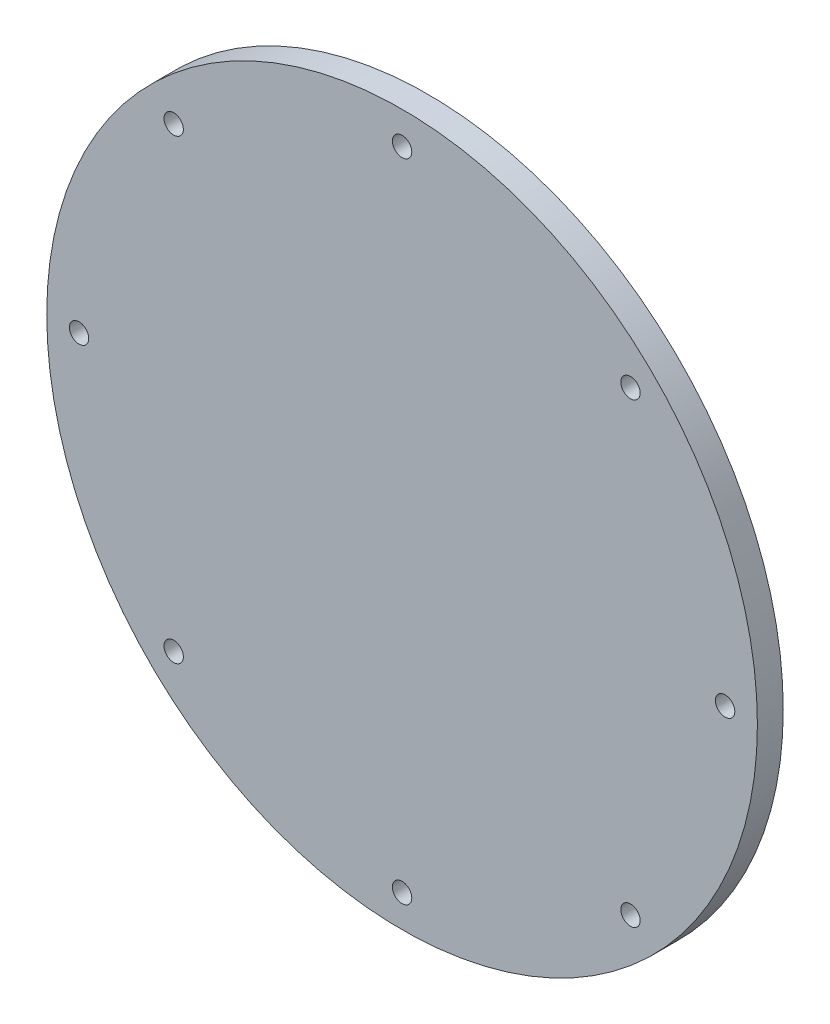
ISO-10303-21;
HEADER;
FILE_DESCRIPTION(('STEP AP214'),'2;1');
FILE_NAME('part.step','',(''),(''),'','','');
FILE_SCHEMA(('AUTOMOTIVE_DESIGN { 1 0 10303 214 1 1 1 1 }'));
ENDSEC;
DATA;
#1=APPLICATION_CONTEXT('core data for automotive mechanical design processes');
#2=APPLICATION_PROTOCOL_DEFINITION('international standard','automotive_design',2000,#1);
#3=PRODUCT_CONTEXT('',#1,'mechanical');
#4=PRODUCT('Part','Part','',(#3));
#5=PRODUCT_RELATED_PRODUCT_CATEGORY('part','',(#4));
#6=PRODUCT_DEFINITION_FORMATION('','',#4);
#7=PRODUCT_DEFINITION_CONTEXT('part definition',#1,'design');
#8=PRODUCT_DEFINITION('design','',#6,#7);
#9=PRODUCT_DEFINITION_SHAPE('','',#8);
#10=(LENGTH_UNIT() NAMED_UNIT(*) SI_UNIT(.MILLI.,.METRE.));
#11=(NAMED_UNIT(*) PLANE_ANGLE_UNIT() SI_UNIT($,.RADIAN.));
#12=(NAMED_UNIT(*) SI_UNIT($,.STERADIAN.) SOLID_ANGLE_UNIT());
#13=UNCERTAINTY_MEASURE_WITH_UNIT(LENGTH_MEASURE(1.E-05),#10,'distance_accuracy_value','');
#14=(GEOMETRIC_REPRESENTATION_CONTEXT(3) GLOBAL_UNCERTAINTY_ASSIGNED_CONTEXT((#13)) GLOBAL_UNIT_ASSIGNED_CONTEXT((#10,
#11,#12)) REPRESENTATION_CONTEXT('',''));
#15=CARTESIAN_POINT('',(0.,0.,0.));
#16=DIRECTION('',(0.,0.,1.));
#17=DIRECTION('',(1.,0.,0.));
#18=AXIS2_PLACEMENT_3D('',#15,#16,#17);
#19=CARTESIAN_POINT('',(0.,0.,8.));
#20=DIRECTION('',(0.,0.,-1.));
#21=DIRECTION('',(-1.,0.,0.));
#22=AXIS2_PLACEMENT_3D('',#19,#20,#21);
#23=CYLINDRICAL_SURFACE('',#22,110.);
#24=CARTESIAN_POINT('',(0.,0.,8.));
#25=DIRECTION('',(0.,0.,1.));
#26=DIRECTION('',(1.,0.,0.));
#27=AXIS2_PLACEMENT_3D('',#24,#25,#26);
#28=CIRCLE('',#27,110.);
#29=CARTESIAN_POINT('',(110.,0.,8.));
#30=VERTEX_POINT('',#29);
#31=EDGE_CURVE('E10',#30,#30,#28,.T.);
#32=ORIENTED_EDGE('',*,*,#31,.F.);
#33=EDGE_LOOP('',(#32));
#34=FACE_BOUND('',#33,.T.);
#35=CARTESIAN_POINT('',(0.,0.,0.));
#36=DIRECTION('',(0.,0.,1.));
#37=DIRECTION('',(1.,0.,0.));
#38=AXIS2_PLACEMENT_3D('',#35,#36,#37);
#39=CIRCLE('',#38,110.);
#40=CARTESIAN_POINT('',(110.,0.,0.));
#41=VERTEX_POINT('',#40);
#42=EDGE_CURVE('E40',#41,#41,#39,.T.);
#43=ORIENTED_EDGE('',*,*,#42,.T.);
#44=EDGE_LOOP('',(#43));
#45=FACE_BOUND('',#44,.T.);
#46=ADVANCED_FACE('F37',(#34,#45),#23,.T.);
#47=CARTESIAN_POINT('',(0.,0.,8.));
#48=DIRECTION('',(0.,0.,1.));
#49=DIRECTION('',(1.,0.,0.));
#50=AXIS2_PLACEMENT_3D('',#47,#48,#49);
#51=PLANE('',#50);
#52=CARTESIAN_POINT('',(0.,100.,8.));
#53=DIRECTION('',(0.,0.,1.));
#54=DIRECTION('',(1.,0.,0.));
#55=AXIS2_PLACEMENT_3D('',#52,#53,#54);
#56=CIRCLE('',#55,3.);
#57=CARTESIAN_POINT('',(3.,100.,8.));
#58=VERTEX_POINT('',#57);
#59=EDGE_CURVE('E91',#58,#58,#56,.T.);
#60=ORIENTED_EDGE('',*,*,#59,.F.);
#61=EDGE_LOOP('',(#60));
#62=FACE_BOUND('',#61,.T.);
#63=CARTESIAN_POINT('',(70.710678118656,70.7106781186578,8.));
#64=DIRECTION('',(0.,0.,1.));
#65=DIRECTION('',(1.,0.,0.));
#66=AXIS2_PLACEMENT_3D('',#63,#64,#65);
#67=CIRCLE('',#66,3.00000000000048);
#68=CARTESIAN_POINT('',(73.7106781186565,70.7106781186578,8.));
#69=VERTEX_POINT('',#68);
#70=EDGE_CURVE('E85',#69,#69,#67,.T.);
#71=ORIENTED_EDGE('',*,*,#70,.F.);
#72=EDGE_LOOP('',(#71));
#73=FACE_BOUND('',#72,.T.);
#74=CARTESIAN_POINT('',(100.000000000004,4.25100994656913E-12,8.));
#75=DIRECTION('',(0.,0.,1.));
#76=DIRECTION('',(1.,0.,0.));
#77=AXIS2_PLACEMENT_3D('',#74,#75,#76);
#78=CIRCLE('',#77,3.00000000000316);
#79=CARTESIAN_POINT('',(103.000000000007,4.25100994656913E-12,8.));
#80=VERTEX_POINT('',#79);
#81=EDGE_CURVE('E79',#80,#80,#78,.T.);
#82=ORIENTED_EDGE('',*,*,#81,.F.);
#83=EDGE_LOOP('',(#82));
#84=FACE_BOUND('',#83,.T.);
#85=CARTESIAN_POINT('',(70.710678118662,-70.7106781186518,8.));
#86=DIRECTION('',(0.,0.,1.));
#87=DIRECTION('',(1.,0.,0.));
#88=AXIS2_PLACEMENT_3D('',#85,#86,#87);
#89=CIRCLE('',#88,3.00000000000658);
#90=CARTESIAN_POINT('',(73.7106781186686,-70.7106781186518,8.));
#91=VERTEX_POINT('',#90);
#92=EDGE_CURVE('E73',#91,#91,#89,.T.);
#93=ORIENTED_EDGE('',*,*,#92,.F.);
#94=EDGE_LOOP('',(#93));
#95=FACE_BOUND('',#94,.T.);
#96=CARTESIAN_POINT('',(8.50201989313826E-12,-100.,8.));
#97=DIRECTION('',(0.,0.,1.));
#98=DIRECTION('',(1.,0.,0.));
#99=AXIS2_PLACEMENT_3D('',#96,#97,#98);
#100=CIRCLE('',#99,3.0000000000088);
#101=CARTESIAN_POINT('',(3.0000000000173,-100.,8.));
#102=VERTEX_POINT('',#101);
#103=EDGE_CURVE('E67',#102,#102,#100,.T.);
#104=ORIENTED_EDGE('',*,*,#103,.F.);
#105=EDGE_LOOP('',(#104));
#106=FACE_BOUND('',#105,.T.);
#107=CARTESIAN_POINT('',(-70.7106781186475,-70.7106781186578,8.));
#108=DIRECTION('',(0.,0.,1.));
#109=DIRECTION('',(1.,0.,0.));
#110=AXIS2_PLACEMENT_3D('',#107,#108,#109);
#111=CIRCLE('',#110,3.00000000000865);
#112=CARTESIAN_POINT('',(-67.7106781186389,-70.7106781186578,8.));
#113=VERTEX_POINT('',#112);
#114=EDGE_CURVE('E61',#113,#113,#111,.T.);
#115=ORIENTED_EDGE('',*,*,#114,.F.);
#116=EDGE_LOOP('',(#115));
#117=FACE_BOUND('',#116,.T.);
#118=CARTESIAN_POINT('',(-99.9999999999958,-4.2632564145606E-12,8.));
#119=DIRECTION('',(0.,0.,1.));
#120=DIRECTION('',(1.,0.,0.));
#121=AXIS2_PLACEMENT_3D('',#118,#119,#120);
#122=CIRCLE('',#121,3.00000000000632);
#123=CARTESIAN_POINT('',(-96.9999999999894,-4.2632564145606E-12,8.));
#124=VERTEX_POINT('',#123);
#125=EDGE_CURVE('E55',#124,#124,#122,.T.);
#126=ORIENTED_EDGE('',*,*,#125,.F.);
#127=EDGE_LOOP('',(#126));
#128=FACE_BOUND('',#127,.T.);
#129=CARTESIAN_POINT('',(-70.7106781186535,70.7106781186517,8.));
#130=DIRECTION('',(0.,0.,1.));
#131=DIRECTION('',(1.,0.,0.));
#132=AXIS2_PLACEMENT_3D('',#129,#130,#131);
#133=CIRCLE('',#132,3.00000000000324);
#134=CARTESIAN_POINT('',(-67.7106781186503,70.7106781186517,8.));
#135=VERTEX_POINT('',#134);
#136=EDGE_CURVE('E49',#135,#135,#133,.T.);
#137=ORIENTED_EDGE('',*,*,#136,.F.);
#138=EDGE_LOOP('',(#137));
#139=FACE_BOUND('',#138,.T.);
#140=ORIENTED_EDGE('',*,*,#31,.T.);
#141=EDGE_LOOP('',(#140));
#142=FACE_BOUND('',#141,.T.);
#143=ADVANCED_FACE('F107',(#62,#73,#84,#95,#106,#117,#128,#139,#142),#51,.T.);
#144=CARTESIAN_POINT('',(0.,0.,0.));
#145=DIRECTION('',(0.,0.,1.));
#146=DIRECTION('',(1.,0.,0.));
#147=AXIS2_PLACEMENT_3D('',#144,#145,#146);
#148=PLANE('',#147);
#149=CARTESIAN_POINT('',(0.,100.,0.));
#150=DIRECTION('',(0.,0.,1.));
#151=DIRECTION('',(1.,0.,0.));
#152=AXIS2_PLACEMENT_3D('',#149,#150,#151);
#153=CIRCLE('',#152,3.);
#154=CARTESIAN_POINT('',(3.,100.,0.));
#155=VERTEX_POINT('',#154);
#156=EDGE_CURVE('E47',#155,#155,#153,.T.);
#157=ORIENTED_EDGE('',*,*,#156,.T.);
#158=EDGE_LOOP('',(#157));
#159=FACE_BOUND('',#158,.T.);
#160=CARTESIAN_POINT('',(70.710678118656,70.7106781186578,0.));
#161=DIRECTION('',(0.,0.,1.));
#162=DIRECTION('',(1.,0.,0.));
#163=AXIS2_PLACEMENT_3D('',#160,#161,#162);
#164=CIRCLE('',#163,3.00000000000048);
#165=CARTESIAN_POINT('',(73.7106781186565,70.7106781186578,0.));
#166=VERTEX_POINT('',#165);
#167=EDGE_CURVE('E88',#166,#166,#164,.T.);
#168=ORIENTED_EDGE('',*,*,#167,.T.);
#169=EDGE_LOOP('',(#168));
#170=FACE_BOUND('',#169,.T.);
#171=CARTESIAN_POINT('',(100.000000000004,4.25100994656913E-12,0.));
#172=DIRECTION('',(0.,0.,1.));
#173=DIRECTION('',(1.,0.,0.));
#174=AXIS2_PLACEMENT_3D('',#171,#172,#173);
#175=CIRCLE('',#174,3.00000000000316);
#176=CARTESIAN_POINT('',(103.000000000007,4.25100994656913E-12,0.));
#177=VERTEX_POINT('',#176);
#178=EDGE_CURVE('E82',#177,#177,#175,.T.);
#179=ORIENTED_EDGE('',*,*,#178,.T.);
#180=EDGE_LOOP('',(#179));
#181=FACE_BOUND('',#180,.T.);
#182=CARTESIAN_POINT('',(70.710678118662,-70.7106781186518,0.));
#183=DIRECTION('',(0.,0.,1.));
#184=DIRECTION('',(1.,0.,0.));
#185=AXIS2_PLACEMENT_3D('',#182,#183,#184);
#186=CIRCLE('',#185,3.00000000000658);
#187=CARTESIAN_POINT('',(73.7106781186686,-70.7106781186518,0.));
#188=VERTEX_POINT('',#187);
#189=EDGE_CURVE('E76',#188,#188,#186,.T.);
#190=ORIENTED_EDGE('',*,*,#189,.T.);
#191=EDGE_LOOP('',(#190));
#192=FACE_BOUND('',#191,.T.);
#193=CARTESIAN_POINT('',(8.50201989313826E-12,-100.,0.));
#194=DIRECTION('',(0.,0.,1.));
#195=DIRECTION('',(1.,0.,0.));
#196=AXIS2_PLACEMENT_3D('',#193,#194,#195);
#197=CIRCLE('',#196,3.0000000000088);
#198=CARTESIAN_POINT('',(3.0000000000173,-100.,0.));
#199=VERTEX_POINT('',#198);
#200=EDGE_CURVE('E70',#199,#199,#197,.T.);
#201=ORIENTED_EDGE('',*,*,#200,.T.);
#202=EDGE_LOOP('',(#201));
#203=FACE_BOUND('',#202,.T.);
#204=CARTESIAN_POINT('',(-70.7106781186475,-70.7106781186578,0.));
#205=DIRECTION('',(0.,0.,1.));
#206=DIRECTION('',(1.,0.,0.));
#207=AXIS2_PLACEMENT_3D('',#204,#205,#206);
#208=CIRCLE('',#207,3.00000000000865);
#209=CARTESIAN_POINT('',(-67.7106781186389,-70.7106781186578,0.));
#210=VERTEX_POINT('',#209);
#211=EDGE_CURVE('E64',#210,#210,#208,.T.);
#212=ORIENTED_EDGE('',*,*,#211,.T.);
#213=EDGE_LOOP('',(#212));
#214=FACE_BOUND('',#213,.T.);
#215=CARTESIAN_POINT('',(-99.9999999999958,-4.2632564145606E-12,0.));
#216=DIRECTION('',(0.,0.,1.));
#217=DIRECTION('',(1.,0.,0.));
#218=AXIS2_PLACEMENT_3D('',#215,#216,#217);
#219=CIRCLE('',#218,3.00000000000632);
#220=CARTESIAN_POINT('',(-96.9999999999894,-4.2632564145606E-12,0.));
#221=VERTEX_POINT('',#220);
#222=EDGE_CURVE('E58',#221,#221,#219,.T.);
#223=ORIENTED_EDGE('',*,*,#222,.T.);
#224=EDGE_LOOP('',(#223));
#225=FACE_BOUND('',#224,.T.);
#226=CARTESIAN_POINT('',(-70.7106781186535,70.7106781186517,0.));
#227=DIRECTION('',(0.,0.,1.));
#228=DIRECTION('',(1.,0.,0.));
#229=AXIS2_PLACEMENT_3D('',#226,#227,#228);
#230=CIRCLE('',#229,3.00000000000324);
#231=CARTESIAN_POINT('',(-67.7106781186503,70.7106781186517,0.));
#232=VERTEX_POINT('',#231);
#233=EDGE_CURVE('E52',#232,#232,#230,.T.);
#234=ORIENTED_EDGE('',*,*,#233,.T.);
#235=EDGE_LOOP('',(#234));
#236=FACE_BOUND('',#235,.T.);
#237=ORIENTED_EDGE('',*,*,#42,.F.);
#238=EDGE_LOOP('',(#237));
#239=FACE_BOUND('',#238,.T.);
#240=ADVANCED_FACE('F97',(#159,#170,#181,#192,#203,#214,#225,#236,#239),#148,.F.);
#241=CARTESIAN_POINT('',(-70.7106781186535,70.7106781186517,0.));
#242=DIRECTION('',(0.,0.,1.));
#243=DIRECTION('',(1.,0.,0.));
#244=AXIS2_PLACEMENT_3D('',#241,#242,#243);
#245=CYLINDRICAL_SURFACE('',#244,3.00000000000324);
#246=ORIENTED_EDGE('',*,*,#233,.F.);
#247=EDGE_LOOP('',(#246));
#248=FACE_BOUND('',#247,.T.);
#249=ORIENTED_EDGE('',*,*,#136,.T.);
#250=EDGE_LOOP('',(#249));
#251=FACE_BOUND('',#250,.T.);
#252=ADVANCED_FACE('F125',(#248,#251),#245,.F.);
#253=CARTESIAN_POINT('',(-99.9999999999958,-4.2632564145606E-12,0.));
#254=DIRECTION('',(0.,0.,1.));
#255=DIRECTION('',(1.,0.,0.));
#256=AXIS2_PLACEMENT_3D('',#253,#254,#255);
#257=CYLINDRICAL_SURFACE('',#256,3.00000000000632);
#258=ORIENTED_EDGE('',*,*,#222,.F.);
#259=EDGE_LOOP('',(#258));
#260=FACE_BOUND('',#259,.T.);
#261=ORIENTED_EDGE('',*,*,#125,.T.);
#262=EDGE_LOOP('',(#261));
#263=FACE_BOUND('',#262,.T.);
#264=ADVANCED_FACE('F127',(#260,#263),#257,.F.);
#265=CARTESIAN_POINT('',(-70.7106781186475,-70.7106781186578,0.));
#266=DIRECTION('',(0.,0.,1.));
#267=DIRECTION('',(1.,0.,0.));
#268=AXIS2_PLACEMENT_3D('',#265,#266,#267);
#269=CYLINDRICAL_SURFACE('',#268,3.00000000000865);
#270=ORIENTED_EDGE('',*,*,#211,.F.);
#271=EDGE_LOOP('',(#270));
#272=FACE_BOUND('',#271,.T.);
#273=ORIENTED_EDGE('',*,*,#114,.T.);
#274=EDGE_LOOP('',(#273));
#275=FACE_BOUND('',#274,.T.);
#276=ADVANCED_FACE('F134',(#272,#275),#269,.F.);
#277=CARTESIAN_POINT('',(8.50201989313826E-12,-100.,0.));
#278=DIRECTION('',(0.,0.,1.));
#279=DIRECTION('',(1.,0.,0.));
#280=AXIS2_PLACEMENT_3D('',#277,#278,#279);
#281=CYLINDRICAL_SURFACE('',#280,3.0000000000088);
#282=ORIENTED_EDGE('',*,*,#200,.F.);
#283=EDGE_LOOP('',(#282));
#284=FACE_BOUND('',#283,.T.);
#285=ORIENTED_EDGE('',*,*,#103,.T.);
#286=EDGE_LOOP('',(#285));
#287=FACE_BOUND('',#286,.T.);
#288=ADVANCED_FACE('F175',(#284,#287),#281,.F.);
#289=CARTESIAN_POINT('',(70.710678118662,-70.7106781186518,0.));
#290=DIRECTION('',(0.,0.,1.));
#291=DIRECTION('',(1.,0.,0.));
#292=AXIS2_PLACEMENT_3D('',#289,#290,#291);
#293=CYLINDRICAL_SURFACE('',#292,3.00000000000658);
#294=ORIENTED_EDGE('',*,*,#189,.F.);
#295=EDGE_LOOP('',(#294));
#296=FACE_BOUND('',#295,.T.);
#297=ORIENTED_EDGE('',*,*,#92,.T.);
#298=EDGE_LOOP('',(#297));
#299=FACE_BOUND('',#298,.T.);
#300=ADVANCED_FACE('F186',(#296,#299),#293,.F.);
#301=CARTESIAN_POINT('',(100.000000000004,4.25100994656913E-12,0.));
#302=DIRECTION('',(0.,0.,1.));
#303=DIRECTION('',(1.,0.,0.));
#304=AXIS2_PLACEMENT_3D('',#301,#302,#303);
#305=CYLINDRICAL_SURFACE('',#304,3.00000000000316);
#306=ORIENTED_EDGE('',*,*,#178,.F.);
#307=EDGE_LOOP('',(#306));
#308=FACE_BOUND('',#307,.T.);
#309=ORIENTED_EDGE('',*,*,#81,.T.);
#310=EDGE_LOOP('',(#309));
#311=FACE_BOUND('',#310,.T.);
#312=ADVANCED_FACE('F197',(#308,#311),#305,.F.);
#313=CARTESIAN_POINT('',(70.710678118656,70.7106781186578,0.));
#314=DIRECTION('',(0.,0.,1.));
#315=DIRECTION('',(1.,0.,0.));
#316=AXIS2_PLACEMENT_3D('',#313,#314,#315);
#317=CYLINDRICAL_SURFACE('',#316,3.00000000000048);
#318=ORIENTED_EDGE('',*,*,#167,.F.);
#319=EDGE_LOOP('',(#318));
#320=FACE_BOUND('',#319,.T.);
#321=ORIENTED_EDGE('',*,*,#70,.T.);
#322=EDGE_LOOP('',(#321));
#323=FACE_BOUND('',#322,.T.);
#324=ADVANCED_FACE('F103',(#320,#323),#317,.F.);
#325=CARTESIAN_POINT('',(0.,100.,0.));
#326=DIRECTION('',(0.,0.,1.));
#327=DIRECTION('',(1.,0.,0.));
#328=AXIS2_PLACEMENT_3D('',#325,#326,#327);
#329=CYLINDRICAL_SURFACE('',#328,3.);
#330=ORIENTED_EDGE('',*,*,#156,.F.);
#331=EDGE_LOOP('',(#330));
#332=FACE_BOUND('',#331,.T.);
#333=ORIENTED_EDGE('',*,*,#59,.T.);
#334=EDGE_LOOP('',(#333));
#335=FACE_BOUND('',#334,.T.);
#336=ADVANCED_FACE('F100',(#332,#335),#329,.F.);
#337=CLOSED_SHELL('',(#46,#143,#240,#252,#264,#276,#288,#300,#312,#324,#336));
#338=MANIFOLD_SOLID_BREP('B2',#337);
#339=ADVANCED_BREP_SHAPE_REPRESENTATION('',(#18,#338),#14);
#340=SHAPE_DEFINITION_REPRESENTATION(#9,#339);
ENDSEC;
END-ISO-10303-21;
